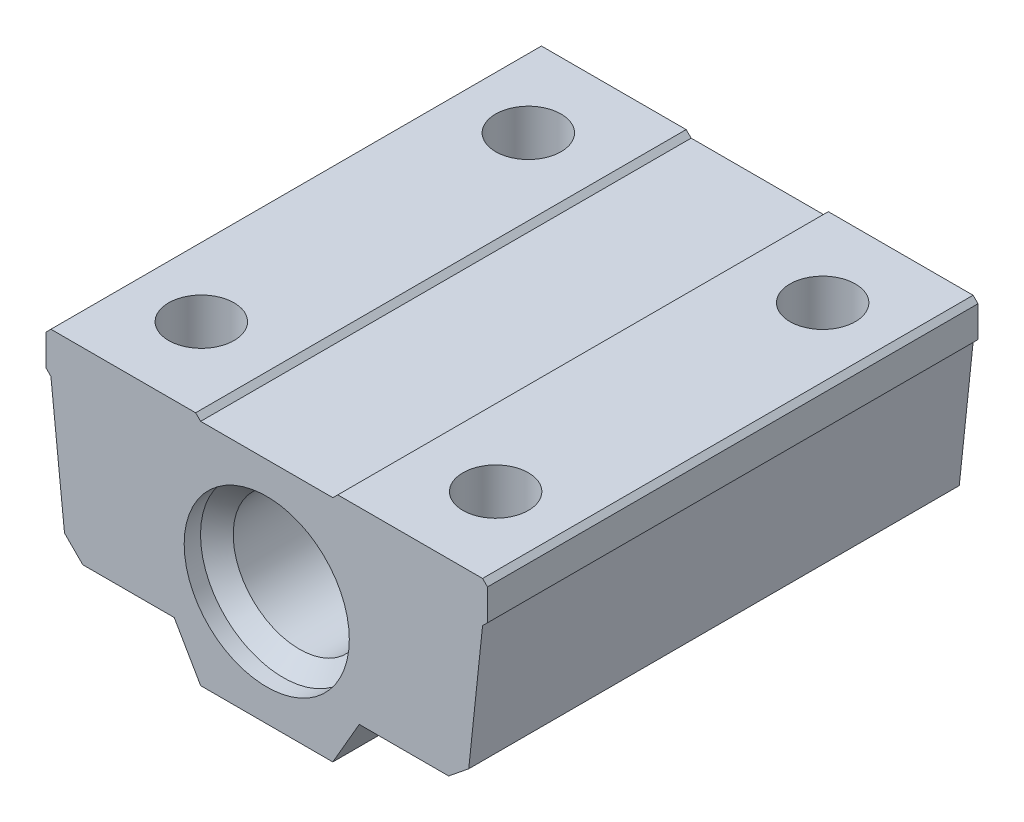
ISO-10303-21;
HEADER;
FILE_DESCRIPTION(('STEP AP214'),'2;1');
FILE_NAME('part.step','',(''),(''),'','','');
FILE_SCHEMA(('AUTOMOTIVE_DESIGN { 1 0 10303 214 1 1 1 1 }'));
ENDSEC;
DATA;
#1=APPLICATION_CONTEXT('core data for automotive mechanical design processes');
#2=APPLICATION_PROTOCOL_DEFINITION('international standard','automotive_design',2000,#1);
#3=PRODUCT_CONTEXT('',#1,'mechanical');
#4=PRODUCT('Part','Part','',(#3));
#5=PRODUCT_RELATED_PRODUCT_CATEGORY('part','',(#4));
#6=PRODUCT_DEFINITION_FORMATION('','',#4);
#7=PRODUCT_DEFINITION_CONTEXT('part definition',#1,'design');
#8=PRODUCT_DEFINITION('design','',#6,#7);
#9=PRODUCT_DEFINITION_SHAPE('','',#8);
#10=(LENGTH_UNIT() NAMED_UNIT(*) SI_UNIT(.MILLI.,.METRE.));
#11=(NAMED_UNIT(*) PLANE_ANGLE_UNIT() SI_UNIT($,.RADIAN.));
#12=(NAMED_UNIT(*) SI_UNIT($,.STERADIAN.) SOLID_ANGLE_UNIT());
#13=UNCERTAINTY_MEASURE_WITH_UNIT(LENGTH_MEASURE(1.E-05),#10,'distance_accuracy_value','');
#14=(GEOMETRIC_REPRESENTATION_CONTEXT(3) GLOBAL_UNCERTAINTY_ASSIGNED_CONTEXT((#13)) GLOBAL_UNIT_ASSIGNED_CONTEXT((#10,
#11,#12)) REPRESENTATION_CONTEXT('',''));
#15=CARTESIAN_POINT('',(0.,0.,0.));
#16=DIRECTION('',(0.,0.,1.));
#17=DIRECTION('',(1.,0.,0.));
#18=AXIS2_PLACEMENT_3D('',#15,#16,#17);
#19=CARTESIAN_POINT('',(0.,0.,14.));
#20=DIRECTION('',(0.,0.,-1.));
#21=DIRECTION('',(-1.,0.,0.));
#22=AXIS2_PLACEMENT_3D('',#19,#20,#21);
#23=CYLINDRICAL_SURFACE('',#22,5.05);
#24=CARTESIAN_POINT('',(0.,0.,14.));
#25=DIRECTION('',(0.,0.,1.));
#26=DIRECTION('',(1.,0.,0.));
#27=AXIS2_PLACEMENT_3D('',#24,#25,#26);
#28=CIRCLE('',#27,5.05);
#29=CARTESIAN_POINT('',(5.05,0.,14.));
#30=VERTEX_POINT('',#29);
#31=EDGE_CURVE('E60',#30,#30,#28,.T.);
#32=ORIENTED_EDGE('',*,*,#31,.F.);
#33=EDGE_LOOP('',(#32));
#34=FACE_BOUND('',#33,.T.);
#35=CARTESIAN_POINT('',(0.,0.,-14.));
#36=DIRECTION('',(0.,0.,1.));
#37=DIRECTION('',(1.,0.,0.));
#38=AXIS2_PLACEMENT_3D('',#35,#36,#37);
#39=CIRCLE('',#38,5.05);
#40=CARTESIAN_POINT('',(5.05,0.,-14.));
#41=VERTEX_POINT('',#40);
#42=EDGE_CURVE('E64',#41,#41,#39,.T.);
#43=ORIENTED_EDGE('',*,*,#42,.T.);
#44=EDGE_LOOP('',(#43));
#45=FACE_BOUND('',#44,.T.);
#46=ADVANCED_FACE('F49',(#34,#45),#23,.T.);
#47=CARTESIAN_POINT('',(0.,0.,-15.));
#48=DIRECTION('',(0.,0.,1.));
#49=DIRECTION('',(1.,0.,0.));
#50=AXIS2_PLACEMENT_3D('',#47,#48,#49);
#51=CYLINDRICAL_SURFACE('',#50,4.05);
#52=CARTESIAN_POINT('',(0.,0.,-13.));
#53=DIRECTION('',(0.,0.,1.));
#54=DIRECTION('',(1.,0.,0.));
#55=AXIS2_PLACEMENT_3D('',#52,#53,#54);
#56=CIRCLE('',#55,4.05);
#57=CARTESIAN_POINT('',(4.05,0.,-13.));
#58=VERTEX_POINT('',#57);
#59=EDGE_CURVE('E11',#58,#58,#56,.F.);
#60=ORIENTED_EDGE('',*,*,#59,.T.);
#61=EDGE_LOOP('',(#60));
#62=FACE_BOUND('',#61,.T.);
#63=CARTESIAN_POINT('',(0.,0.,13.));
#64=DIRECTION('',(0.,0.,1.));
#65=DIRECTION('',(1.,0.,0.));
#66=AXIS2_PLACEMENT_3D('',#63,#64,#65);
#67=CIRCLE('',#66,4.05);
#68=CARTESIAN_POINT('',(4.05,0.,13.));
#69=VERTEX_POINT('',#68);
#70=EDGE_CURVE('E56',#69,#69,#67,.T.);
#71=ORIENTED_EDGE('',*,*,#70,.T.);
#72=EDGE_LOOP('',(#71));
#73=FACE_BOUND('',#72,.T.);
#74=ADVANCED_FACE('F73',(#62,#73),#51,.F.);
#75=CARTESIAN_POINT('',(0.,0.,-14.));
#76=DIRECTION('',(0.,0.,-1.));
#77=DIRECTION('',(-1.,0.,0.));
#78=AXIS2_PLACEMENT_3D('',#75,#76,#77);
#79=CONICAL_SURFACE('',#78,5.05,0.785398163397447);
#80=ORIENTED_EDGE('',*,*,#59,.F.);
#81=EDGE_LOOP('',(#80));
#82=FACE_BOUND('',#81,.T.);
#83=ORIENTED_EDGE('',*,*,#42,.F.);
#84=EDGE_LOOP('',(#83));
#85=FACE_BOUND('',#84,.T.);
#86=ADVANCED_FACE('F71',(#82,#85),#79,.F.);
#87=CARTESIAN_POINT('',(0.,0.,13.));
#88=DIRECTION('',(0.,0.,1.));
#89=DIRECTION('',(1.,0.,0.));
#90=AXIS2_PLACEMENT_3D('',#87,#88,#89);
#91=CONICAL_SURFACE('',#90,4.05,0.785398163397448);
#92=ORIENTED_EDGE('',*,*,#31,.T.);
#93=EDGE_LOOP('',(#92));
#94=FACE_BOUND('',#93,.T.);
#95=ORIENTED_EDGE('',*,*,#70,.F.);
#96=EDGE_LOOP('',(#95));
#97=FACE_BOUND('',#96,.T.);
#98=ADVANCED_FACE('F51',(#94,#97),#91,.F.);
#99=CLOSED_SHELL('',(#46,#74,#86,#98));
#100=MANIFOLD_SOLID_BREP('B2',#99);
#101=CARTESIAN_POINT('',(4.04145188432738,-7.,15.));
#102=DIRECTION('',(-0.866025403784439,0.5,0.));
#103=DIRECTION('',(-0.5,-0.866025403784439,0.));
#104=AXIS2_PLACEMENT_3D('',#101,#102,#103);
#105=PLANE('',#104);
#106=DIRECTION('',(0.,0.,-1.));
#107=VECTOR('',#106,1.);
#108=CARTESIAN_POINT('',(5.65803263805833,-4.2,15.));
#109=LINE('',#108,#107);
#110=CARTESIAN_POINT('',(5.65803263805833,-4.2,15.));
#111=VERTEX_POINT('',#110);
#112=CARTESIAN_POINT('',(5.65803263805833,-4.2,-15.));
#113=VERTEX_POINT('',#112);
#114=EDGE_CURVE('E357',#111,#113,#109,.T.);
#115=ORIENTED_EDGE('',*,*,#114,.F.);
#116=DIRECTION('',(0.5,0.866025403784439,0.));
#117=VECTOR('',#116,1.);
#118=CARTESIAN_POINT('',(4.04145188432738,-7.,15.));
#119=LINE('',#118,#117);
#120=CARTESIAN_POINT('',(4.04145188432738,-7.,15.));
#121=VERTEX_POINT('',#120);
#122=EDGE_CURVE('E365',#121,#111,#119,.T.);
#123=ORIENTED_EDGE('',*,*,#122,.F.);
#124=DIRECTION('',(0.,0.,-1.));
#125=VECTOR('',#124,1.);
#126=CARTESIAN_POINT('',(4.04145188432738,-7.,15.));
#127=LINE('',#126,#125);
#128=CARTESIAN_POINT('',(4.04145188432738,-7.,-15.));
#129=VERTEX_POINT('',#128);
#130=EDGE_CURVE('E396',#121,#129,#127,.T.);
#131=ORIENTED_EDGE('',*,*,#130,.T.);
#132=DIRECTION('',(0.5,0.866025403784439,0.));
#133=VECTOR('',#132,1.);
#134=CARTESIAN_POINT('',(4.04145188432738,-7.,-15.));
#135=LINE('',#134,#133);
#136=EDGE_CURVE('E380',#129,#113,#135,.T.);
#137=ORIENTED_EDGE('',*,*,#136,.T.);
#138=EDGE_LOOP('',(#115,#123,#131,#137));
#139=FACE_BOUND('',#138,.T.);
#140=ADVANCED_FACE('F113',(#139),#105,.F.);
#141=CARTESIAN_POINT('',(-8.08290376865476,0.,15.));
#142=DIRECTION('',(0.866025403784438,0.5,0.));
#143=DIRECTION('',(-0.5,0.866025403784439,0.));
#144=AXIS2_PLACEMENT_3D('',#141,#142,#143);
#145=PLANE('',#144);
#146=DIRECTION('',(0.,0.,-1.));
#147=VECTOR('',#146,1.);
#148=CARTESIAN_POINT('',(-5.65803263805833,-4.2,15.));
#149=LINE('',#148,#147);
#150=CARTESIAN_POINT('',(-5.65803263805833,-4.2,15.));
#151=VERTEX_POINT('',#150);
#152=CARTESIAN_POINT('',(-5.65803263805833,-4.2,-15.));
#153=VERTEX_POINT('',#152);
#154=EDGE_CURVE('E329',#151,#153,#149,.T.);
#155=ORIENTED_EDGE('',*,*,#154,.T.);
#156=DIRECTION('',(0.5,-0.866025403784438,0.));
#157=VECTOR('',#156,1.);
#158=CARTESIAN_POINT('',(-8.08290376865476,0.,-15.));
#159=LINE('',#158,#157);
#160=CARTESIAN_POINT('',(-4.04145188432738,-7.,-15.));
#161=VERTEX_POINT('',#160);
#162=EDGE_CURVE('E366',#153,#161,#159,.T.);
#163=ORIENTED_EDGE('',*,*,#162,.T.);
#164=DIRECTION('',(0.,0.,-1.));
#165=VECTOR('',#164,1.);
#166=CARTESIAN_POINT('',(-4.04145188432738,-7.,15.));
#167=LINE('',#166,#165);
#168=CARTESIAN_POINT('',(-4.04145188432738,-7.,15.));
#169=VERTEX_POINT('',#168);
#170=EDGE_CURVE('E376',#169,#161,#167,.T.);
#171=ORIENTED_EDGE('',*,*,#170,.F.);
#172=DIRECTION('',(0.5,-0.866025403784438,0.));
#173=VECTOR('',#172,1.);
#174=CARTESIAN_POINT('',(-8.08290376865476,0.,15.));
#175=LINE('',#174,#173);
#176=EDGE_CURVE('E373',#151,#169,#175,.T.);
#177=ORIENTED_EDGE('',*,*,#176,.F.);
#178=EDGE_LOOP('',(#155,#163,#171,#177));
#179=FACE_BOUND('',#178,.T.);
#180=ADVANCED_FACE('F535',(#179),#145,.F.);
#181=CARTESIAN_POINT('',(-4.04145188432738,-7.,15.));
#182=DIRECTION('',(0.,1.,0.));
#183=DIRECTION('',(-1.,0.,0.));
#184=AXIS2_PLACEMENT_3D('',#181,#182,#183);
#185=PLANE('',#184);
#186=DIRECTION('',(1.,0.,0.));
#187=VECTOR('',#186,1.);
#188=CARTESIAN_POINT('',(-4.04145188432738,-7.,-15.));
#189=LINE('',#188,#187);
#190=EDGE_CURVE('E360',#161,#129,#189,.T.);
#191=ORIENTED_EDGE('',*,*,#190,.T.);
#192=ORIENTED_EDGE('',*,*,#130,.F.);
#193=DIRECTION('',(1.,0.,0.));
#194=VECTOR('',#193,1.);
#195=CARTESIAN_POINT('',(-4.04145188432738,-7.,15.));
#196=LINE('',#195,#194);
#197=EDGE_CURVE('E361',#169,#121,#196,.T.);
#198=ORIENTED_EDGE('',*,*,#197,.F.);
#199=ORIENTED_EDGE('',*,*,#170,.T.);
#200=EDGE_LOOP('',(#191,#192,#198,#199));
#201=FACE_BOUND('',#200,.T.);
#202=ADVANCED_FACE('F541',(#201),#185,.F.);
#203=CARTESIAN_POINT('',(4.04145188432738,7.,15.));
#204=DIRECTION('',(0.,-1.,0.));
#205=DIRECTION('',(0.,0.,-1.));
#206=AXIS2_PLACEMENT_3D('',#203,#204,#205);
#207=PLANE('',#206);
#208=DIRECTION('',(-1.,0.,0.));
#209=VECTOR('',#208,1.);
#210=CARTESIAN_POINT('',(4.04145188432738,7.,-15.));
#211=LINE('',#210,#209);
#212=CARTESIAN_POINT('',(4.04516962656286,7.,-15.));
#213=VERTEX_POINT('',#212);
#214=CARTESIAN_POINT('',(-4.04145188432738,7.,-15.));
#215=VERTEX_POINT('',#214);
#216=EDGE_CURVE('E384',#213,#215,#211,.T.);
#217=ORIENTED_EDGE('',*,*,#216,.T.);
#218=DIRECTION('',(0.,0.,-1.));
#219=VECTOR('',#218,1.);
#220=CARTESIAN_POINT('',(-4.04145188432738,7.,15.));
#221=LINE('',#220,#219);
#222=CARTESIAN_POINT('',(-4.04145188432738,7.,15.));
#223=VERTEX_POINT('',#222);
#224=EDGE_CURVE('E392',#223,#215,#221,.T.);
#225=ORIENTED_EDGE('',*,*,#224,.F.);
#226=DIRECTION('',(-1.,0.,0.));
#227=VECTOR('',#226,1.);
#228=CARTESIAN_POINT('',(4.04145188432738,7.,15.));
#229=LINE('',#228,#227);
#230=CARTESIAN_POINT('',(4.04516962656286,7.,15.));
#231=VERTEX_POINT('',#230);
#232=EDGE_CURVE('E370',#231,#223,#229,.T.);
#233=ORIENTED_EDGE('',*,*,#232,.F.);
#234=DIRECTION('',(0.,0.,1.));
#235=VECTOR('',#234,1.);
#236=CARTESIAN_POINT('',(4.04516962656286,7.,15.));
#237=LINE('',#236,#235);
#238=EDGE_CURVE('E452',#231,#213,#237,.F.);
#239=ORIENTED_EDGE('',*,*,#238,.T.);
#240=EDGE_LOOP('',(#217,#225,#233,#239));
#241=FACE_BOUND('',#240,.T.);
#242=ADVANCED_FACE('F547',(#241),#207,.F.);
#243=CARTESIAN_POINT('',(0.,0.,15.));
#244=DIRECTION('',(0.,0.,1.));
#245=DIRECTION('',(1.,0.,0.));
#246=AXIS2_PLACEMENT_3D('',#243,#244,#245);
#247=PLANE('',#246);
#248=CARTESIAN_POINT('',(0.,0.,15.));
#249=DIRECTION('',(0.,0.,1.));
#250=DIRECTION('',(1.,0.,0.));
#251=AXIS2_PLACEMENT_3D('',#248,#249,#250);
#252=CIRCLE('',#251,5.05);
#253=CARTESIAN_POINT('',(5.05,0.,15.));
#254=VERTEX_POINT('',#253);
#255=EDGE_CURVE('E498',#254,#254,#252,.T.);
#256=ORIENTED_EDGE('',*,*,#255,.F.);
#257=EDGE_LOOP('',(#256));
#258=FACE_BOUND('',#257,.T.);
#259=DIRECTION('',(1.,0.,0.));
#260=VECTOR('',#259,1.);
#261=CARTESIAN_POINT('',(5.65803263805833,-4.2,15.));
#262=LINE('',#261,#260);
#263=CARTESIAN_POINT('',(11.1257763975155,-4.2,15.));
#264=VERTEX_POINT('',#263);
#265=EDGE_CURVE('E303',#111,#264,#262,.T.);
#266=ORIENTED_EDGE('',*,*,#265,.T.);
#267=DIRECTION('',(-0.777426792575264,-0.628973435199086,0.));
#268=VECTOR('',#267,1.);
#269=CARTESIAN_POINT('',(6.45516086200057,-7.97873920210005,15.));
#270=LINE('',#269,#268);
#271=CARTESIAN_POINT('',(12.3549723756906,-3.20552486187844,15.));
#272=VERTEX_POINT('',#271);
#273=EDGE_CURVE('E284',#264,#272,#270,.F.);
#274=ORIENTED_EDGE('',*,*,#273,.T.);
#275=DIRECTION('',(-0.104972375690609,-0.994475138121547,0.));
#276=VECTOR('',#275,1.);
#277=CARTESIAN_POINT('',(13.2,4.8,15.));
#278=LINE('',#277,#276);
#279=CARTESIAN_POINT('',(13.2,4.8,15.));
#280=VERTEX_POINT('',#279);
#281=EDGE_CURVE('E275',#280,#272,#278,.T.);
#282=ORIENTED_EDGE('',*,*,#281,.F.);
#283=DIRECTION('',(-0.707106781186543,-0.707106781186552,0.));
#284=VECTOR('',#283,1.);
#285=CARTESIAN_POINT('',(4.20000000000008,-4.20000000000003,15.));
#286=LINE('',#285,#284);
#287=CARTESIAN_POINT('',(13.5,5.1,15.));
#288=VERTEX_POINT('',#287);
#289=EDGE_CURVE('E258',#280,#288,#286,.F.);
#290=ORIENTED_EDGE('',*,*,#289,.T.);
#291=DIRECTION('',(0.,1.,0.));
#292=VECTOR('',#291,1.);
#293=CARTESIAN_POINT('',(13.5,-4.2,15.));
#294=LINE('',#293,#292);
#295=CARTESIAN_POINT('',(13.5,7.00000000000001,15.));
#296=VERTEX_POINT('',#295);
#297=EDGE_CURVE('E306',#288,#296,#294,.T.);
#298=ORIENTED_EDGE('',*,*,#297,.T.);
#299=DIRECTION('',(0.707106781186544,-0.707106781186551,0.));
#300=VECTOR('',#299,1.);
#301=CARTESIAN_POINT('',(10.2500000000001,10.25,15.));
#302=LINE('',#301,#300);
#303=CARTESIAN_POINT('',(13.2,7.3,15.));
#304=VERTEX_POINT('',#303);
#305=EDGE_CURVE('E435',#296,#304,#302,.F.);
#306=ORIENTED_EDGE('',*,*,#305,.T.);
#307=DIRECTION('',(-1.,0.,0.));
#308=VECTOR('',#307,1.);
#309=CARTESIAN_POINT('',(13.5,7.3,15.));
#310=LINE('',#309,#308);
#311=CARTESIAN_POINT('',(4.34516962656286,7.3,15.));
#312=VERTEX_POINT('',#311);
#313=EDGE_CURVE('E310',#304,#312,#310,.T.);
#314=ORIENTED_EDGE('',*,*,#313,.T.);
#315=DIRECTION('',(0.707106781186545,0.707106781186551,0.));
#316=VECTOR('',#315,1.);
#317=CARTESIAN_POINT('',(-1.47741518671855,1.47741518671854,15.));
#318=LINE('',#317,#316);
#319=EDGE_CURVE('E428',#312,#231,#318,.F.);
#320=ORIENTED_EDGE('',*,*,#319,.T.);
#321=ORIENTED_EDGE('',*,*,#232,.T.);
#322=DIRECTION('',(-0.0123915226505512,0.99992322213578,0.));
#323=VECTOR('',#322,1.);
#324=CARTESIAN_POINT('',(-4.04516962656285,7.3,15.));
#325=LINE('',#324,#323);
#326=CARTESIAN_POINT('',(-4.04145216976769,7.00002303335925,15.));
#327=VERTEX_POINT('',#326);
#328=EDGE_CURVE('E314',#223,#327,#325,.T.);
#329=ORIENTED_EDGE('',*,*,#328,.T.);
#330=DIRECTION('',(0.715814620733543,-0.698290361342683,0.));
#331=VECTOR('',#330,1.);
#332=CARTESIAN_POINT('',(1.52828648051066,1.56664028029176,15.));
#333=LINE('',#332,#331);
#334=CARTESIAN_POINT('',(-4.34895734310541,7.3,15.));
#335=VERTEX_POINT('',#334);
#336=EDGE_CURVE('E425',#327,#335,#333,.F.);
#337=ORIENTED_EDGE('',*,*,#336,.T.);
#338=DIRECTION('',(-1.,0.,0.));
#339=VECTOR('',#338,1.);
#340=CARTESIAN_POINT('',(-13.5,7.3,15.));
#341=LINE('',#340,#339);
#342=CARTESIAN_POINT('',(-13.2,7.3,15.));
#343=VERTEX_POINT('',#342);
#344=EDGE_CURVE('E318',#335,#343,#341,.T.);
#345=ORIENTED_EDGE('',*,*,#344,.T.);
#346=DIRECTION('',(0.707106781186549,0.707106781186547,0.));
#347=VECTOR('',#346,1.);
#348=CARTESIAN_POINT('',(-10.25,10.25,15.));
#349=LINE('',#348,#347);
#350=CARTESIAN_POINT('',(-13.5,7.,15.));
#351=VERTEX_POINT('',#350);
#352=EDGE_CURVE('E432',#343,#351,#349,.F.);
#353=ORIENTED_EDGE('',*,*,#352,.T.);
#354=DIRECTION('',(0.,-1.,0.));
#355=VECTOR('',#354,1.);
#356=CARTESIAN_POINT('',(-13.5,-4.2,15.));
#357=LINE('',#356,#355);
#358=CARTESIAN_POINT('',(-13.5,5.1,15.));
#359=VERTEX_POINT('',#358);
#360=EDGE_CURVE('E322',#351,#359,#357,.T.);
#361=ORIENTED_EDGE('',*,*,#360,.T.);
#362=DIRECTION('',(-0.707106781186539,0.707106781186556,0.));
#363=VECTOR('',#362,1.);
#364=CARTESIAN_POINT('',(-4.20000000000016,-4.20000000000006,15.));
#365=LINE('',#364,#363);
#366=CARTESIAN_POINT('',(-13.2,4.8,15.));
#367=VERTEX_POINT('',#366);
#368=EDGE_CURVE('E268',#359,#367,#365,.F.);
#369=ORIENTED_EDGE('',*,*,#368,.T.);
#370=DIRECTION('',(-0.104972375690609,0.994475138121547,0.));
#371=VECTOR('',#370,1.);
#372=CARTESIAN_POINT('',(-13.2,4.8,15.));
#373=LINE('',#372,#371);
#374=CARTESIAN_POINT('',(-12.3680124223602,-3.08198757763976,15.));
#375=VERTEX_POINT('',#374);
#376=EDGE_CURVE('E298',#375,#367,#373,.T.);
#377=ORIENTED_EDGE('',*,*,#376,.F.);
#378=DIRECTION('',(-0.70710678118655,0.707106781186545,0.));
#379=VECTOR('',#378,1.);
#380=CARTESIAN_POINT('',(-7.72499999999995,-7.72500000000001,15.));
#381=LINE('',#380,#379);
#382=CARTESIAN_POINT('',(-11.25,-4.2,15.));
#383=VERTEX_POINT('',#382);
#384=EDGE_CURVE('E474',#375,#383,#381,.F.);
#385=ORIENTED_EDGE('',*,*,#384,.T.);
#386=DIRECTION('',(1.,0.,0.));
#387=VECTOR('',#386,1.);
#388=CARTESIAN_POINT('',(-5.65803263805833,-4.2,15.));
#389=LINE('',#388,#387);
#390=EDGE_CURVE('E326',#383,#151,#389,.T.);
#391=ORIENTED_EDGE('',*,*,#390,.T.);
#392=ORIENTED_EDGE('',*,*,#176,.T.);
#393=ORIENTED_EDGE('',*,*,#197,.T.);
#394=ORIENTED_EDGE('',*,*,#122,.T.);
#395=EDGE_LOOP('',(#266,#274,#282,#290,#298,#306,#314,#320,#321,#329,#337,#345,#353,#361,#369,
#377,#385,#391,#392,#393,#394));
#396=FACE_BOUND('',#395,.T.);
#397=ADVANCED_FACE('F283',(#258,#396),#247,.T.);
#398=CARTESIAN_POINT('',(0.,0.,-15.));
#399=DIRECTION('',(0.,0.,1.));
#400=DIRECTION('',(1.,0.,0.));
#401=AXIS2_PLACEMENT_3D('',#398,#399,#400);
#402=PLANE('',#401);
#403=CARTESIAN_POINT('',(0.,0.,-15.));
#404=DIRECTION('',(0.,0.,1.));
#405=DIRECTION('',(1.,0.,0.));
#406=AXIS2_PLACEMENT_3D('',#403,#404,#405);
#407=CIRCLE('',#406,5.05);
#408=CARTESIAN_POINT('',(5.05,0.,-15.));
#409=VERTEX_POINT('',#408);
#410=EDGE_CURVE('E295',#409,#409,#407,.T.);
#411=ORIENTED_EDGE('',*,*,#410,.T.);
#412=EDGE_LOOP('',(#411));
#413=FACE_BOUND('',#412,.T.);
#414=DIRECTION('',(-0.104972375690609,-0.994475138121547,0.));
#415=VECTOR('',#414,1.);
#416=CARTESIAN_POINT('',(13.2,4.8,-15.));
#417=LINE('',#416,#415);
#418=CARTESIAN_POINT('',(13.2,4.8,-15.));
#419=VERTEX_POINT('',#418);
#420=CARTESIAN_POINT('',(12.3549723756906,-3.20552486187844,-15.));
#421=VERTEX_POINT('',#420);
#422=EDGE_CURVE('E278',#419,#421,#417,.T.);
#423=ORIENTED_EDGE('',*,*,#422,.T.);
#424=DIRECTION('',(0.777426792575264,0.628973435199086,0.));
#425=VECTOR('',#424,1.);
#426=CARTESIAN_POINT('',(11.1257763975155,-4.2,-15.));
#427=LINE('',#426,#425);
#428=CARTESIAN_POINT('',(11.1257763975155,-4.2,-15.));
#429=VERTEX_POINT('',#428);
#430=EDGE_CURVE('E484',#421,#429,#427,.F.);
#431=ORIENTED_EDGE('',*,*,#430,.T.);
#432=DIRECTION('',(1.,0.,0.));
#433=VECTOR('',#432,1.);
#434=CARTESIAN_POINT('',(5.65803263805833,-4.2,-15.));
#435=LINE('',#434,#433);
#436=EDGE_CURVE('E280',#113,#429,#435,.T.);
#437=ORIENTED_EDGE('',*,*,#436,.F.);
#438=ORIENTED_EDGE('',*,*,#136,.F.);
#439=ORIENTED_EDGE('',*,*,#190,.F.);
#440=ORIENTED_EDGE('',*,*,#162,.F.);
#441=DIRECTION('',(1.,0.,0.));
#442=VECTOR('',#441,1.);
#443=CARTESIAN_POINT('',(-5.65803263805833,-4.2,-15.));
#444=LINE('',#443,#442);
#445=CARTESIAN_POINT('',(-11.25,-4.2,-15.));
#446=VERTEX_POINT('',#445);
#447=EDGE_CURVE('E307',#446,#153,#444,.T.);
#448=ORIENTED_EDGE('',*,*,#447,.F.);
#449=DIRECTION('',(0.70710678118655,-0.707106781186545,0.));
#450=VECTOR('',#449,1.);
#451=CARTESIAN_POINT('',(-12.3680124223602,-3.08198757763976,-15.));
#452=LINE('',#451,#450);
#453=CARTESIAN_POINT('',(-12.3680124223602,-3.08198757763976,-15.));
#454=VERTEX_POINT('',#453);
#455=EDGE_CURVE('E136',#446,#454,#452,.F.);
#456=ORIENTED_EDGE('',*,*,#455,.T.);
#457=DIRECTION('',(-0.104972375690609,0.994475138121547,0.));
#458=VECTOR('',#457,1.);
#459=CARTESIAN_POINT('',(-13.2,4.8,-15.));
#460=LINE('',#459,#458);
#461=CARTESIAN_POINT('',(-13.2,4.8,-15.));
#462=VERTEX_POINT('',#461);
#463=EDGE_CURVE('E292',#454,#462,#460,.T.);
#464=ORIENTED_EDGE('',*,*,#463,.T.);
#465=DIRECTION('',(0.707106781186539,-0.707106781186556,0.));
#466=VECTOR('',#465,1.);
#467=CARTESIAN_POINT('',(-13.5,5.1,-15.));
#468=LINE('',#467,#466);
#469=CARTESIAN_POINT('',(-13.5,5.1,-15.));
#470=VERTEX_POINT('',#469);
#471=EDGE_CURVE('E465',#462,#470,#468,.F.);
#472=ORIENTED_EDGE('',*,*,#471,.T.);
#473=DIRECTION('',(0.,-1.,0.));
#474=VECTOR('',#473,1.);
#475=CARTESIAN_POINT('',(-13.5,-4.2,-15.));
#476=LINE('',#475,#474);
#477=CARTESIAN_POINT('',(-13.5,7.,-15.));
#478=VERTEX_POINT('',#477);
#479=EDGE_CURVE('E348',#478,#470,#476,.T.);
#480=ORIENTED_EDGE('',*,*,#479,.F.);
#481=DIRECTION('',(-0.707106781186549,-0.707106781186547,0.));
#482=VECTOR('',#481,1.);
#483=CARTESIAN_POINT('',(-13.5,7.,-15.));
#484=LINE('',#483,#482);
#485=CARTESIAN_POINT('',(-13.2,7.3,-15.));
#486=VERTEX_POINT('',#485);
#487=EDGE_CURVE('E414',#478,#486,#484,.F.);
#488=ORIENTED_EDGE('',*,*,#487,.T.);
#489=DIRECTION('',(-1.,0.,0.));
#490=VECTOR('',#489,1.);
#491=CARTESIAN_POINT('',(-13.5,7.3,-15.));
#492=LINE('',#491,#490);
#493=CARTESIAN_POINT('',(-4.34895734310541,7.3,-15.));
#494=VERTEX_POINT('',#493);
#495=EDGE_CURVE('E344',#494,#486,#492,.T.);
#496=ORIENTED_EDGE('',*,*,#495,.F.);
#497=DIRECTION('',(-0.715814620733543,0.698290361342683,0.));
#498=VECTOR('',#497,1.);
#499=CARTESIAN_POINT('',(-4.34895734310541,7.3,-15.));
#500=LINE('',#499,#498);
#501=CARTESIAN_POINT('',(-4.04145216976769,7.00002303335925,-15.));
#502=VERTEX_POINT('',#501);
#503=EDGE_CURVE('E408',#494,#502,#500,.F.);
#504=ORIENTED_EDGE('',*,*,#503,.T.);
#505=DIRECTION('',(-0.0123915226505512,0.99992322213578,0.));
#506=VECTOR('',#505,1.);
#507=CARTESIAN_POINT('',(-4.04516962656285,7.3,-15.));
#508=LINE('',#507,#506);
#509=EDGE_CURVE('E340',#215,#502,#508,.T.);
#510=ORIENTED_EDGE('',*,*,#509,.F.);
#511=ORIENTED_EDGE('',*,*,#216,.F.);
#512=DIRECTION('',(-0.707106781186545,-0.707106781186551,0.));
#513=VECTOR('',#512,1.);
#514=CARTESIAN_POINT('',(4.04140523419236,6.9962356076295,-15.));
#515=LINE('',#514,#513);
#516=CARTESIAN_POINT('',(4.34516962656286,7.3,-15.));
#517=VERTEX_POINT('',#516);
#518=EDGE_CURVE('E411',#213,#517,#515,.F.);
#519=ORIENTED_EDGE('',*,*,#518,.T.);
#520=DIRECTION('',(-1.,0.,0.));
#521=VECTOR('',#520,1.);
#522=CARTESIAN_POINT('',(13.5,7.3,-15.));
#523=LINE('',#522,#521);
#524=CARTESIAN_POINT('',(13.2,7.3,-15.));
#525=VERTEX_POINT('',#524);
#526=EDGE_CURVE('E336',#525,#517,#523,.T.);
#527=ORIENTED_EDGE('',*,*,#526,.F.);
#528=DIRECTION('',(-0.707106781186544,0.707106781186551,0.));
#529=VECTOR('',#528,1.);
#530=CARTESIAN_POINT('',(13.2,7.3,-15.));
#531=LINE('',#530,#529);
#532=CARTESIAN_POINT('',(13.5,7.00000000000001,-15.));
#533=VERTEX_POINT('',#532);
#534=EDGE_CURVE('E417',#525,#533,#531,.F.);
#535=ORIENTED_EDGE('',*,*,#534,.T.);
#536=DIRECTION('',(0.,1.,0.));
#537=VECTOR('',#536,1.);
#538=CARTESIAN_POINT('',(13.5,-4.2,-15.));
#539=LINE('',#538,#537);
#540=CARTESIAN_POINT('',(13.5,5.1,-15.));
#541=VERTEX_POINT('',#540);
#542=EDGE_CURVE('E333',#541,#533,#539,.T.);
#543=ORIENTED_EDGE('',*,*,#542,.F.);
#544=DIRECTION('',(0.707106781186543,0.707106781186552,0.));
#545=VECTOR('',#544,1.);
#546=CARTESIAN_POINT('',(13.2,4.8,-15.));
#547=LINE('',#546,#545);
#548=EDGE_CURVE('E462',#541,#419,#547,.F.);
#549=ORIENTED_EDGE('',*,*,#548,.T.);
#550=EDGE_LOOP('',(#423,#431,#437,#438,#439,#440,#448,#456,#464,#472,#480,#488,#496,#504,#510,
#511,#519,#527,#535,#543,#549));
#551=FACE_BOUND('',#550,.T.);
#552=ADVANCED_FACE('F517',(#413,#551),#402,.F.);
#553=CARTESIAN_POINT('',(-13.5,7.3,15.));
#554=DIRECTION('',(0.,-1.,0.));
#555=DIRECTION('',(1.,0.,0.));
#556=AXIS2_PLACEMENT_3D('',#553,#554,#555);
#557=PLANE('',#556);
#558=CARTESIAN_POINT('',(-9.,7.3,10.));
#559=DIRECTION('',(0.,1.,0.));
#560=DIRECTION('',(-1.,0.,0.));
#561=AXIS2_PLACEMENT_3D('',#558,#559,#560);
#562=CIRCLE('',#561,2.);
#563=CARTESIAN_POINT('',(-11.,7.3,10.));
#564=VERTEX_POINT('',#563);
#565=EDGE_CURVE('E811',#564,#564,#562,.T.);
#566=ORIENTED_EDGE('',*,*,#565,.F.);
#567=EDGE_LOOP('',(#566));
#568=FACE_BOUND('',#567,.T.);
#569=CARTESIAN_POINT('',(-9.,7.3,-10.));
#570=DIRECTION('',(0.,1.,0.));
#571=DIRECTION('',(-1.,0.,0.));
#572=AXIS2_PLACEMENT_3D('',#569,#570,#571);
#573=CIRCLE('',#572,2.);
#574=CARTESIAN_POINT('',(-11.,7.3,-10.));
#575=VERTEX_POINT('',#574);
#576=EDGE_CURVE('E506',#575,#575,#573,.T.);
#577=ORIENTED_EDGE('',*,*,#576,.F.);
#578=EDGE_LOOP('',(#577));
#579=FACE_BOUND('',#578,.T.);
#580=ORIENTED_EDGE('',*,*,#495,.T.);
#581=DIRECTION('',(0.,0.,1.));
#582=VECTOR('',#581,1.);
#583=CARTESIAN_POINT('',(-13.2,7.3,15.));
#584=LINE('',#583,#582);
#585=EDGE_CURVE('E446',#486,#343,#584,.T.);
#586=ORIENTED_EDGE('',*,*,#585,.T.);
#587=ORIENTED_EDGE('',*,*,#344,.F.);
#588=DIRECTION('',(0.,0.,-1.));
#589=VECTOR('',#588,1.);
#590=CARTESIAN_POINT('',(-4.34895734310541,7.3,15.));
#591=LINE('',#590,#589);
#592=EDGE_CURVE('E442',#335,#494,#591,.T.);
#593=ORIENTED_EDGE('',*,*,#592,.T.);
#594=EDGE_LOOP('',(#580,#586,#587,#593));
#595=FACE_BOUND('',#594,.T.);
#596=ADVANCED_FACE('F606',(#568,#579,#595),#557,.F.);
#597=CARTESIAN_POINT('',(-13.5,-4.2,15.));
#598=DIRECTION('',(1.,0.,0.));
#599=DIRECTION('',(0.,0.,-1.));
#600=AXIS2_PLACEMENT_3D('',#597,#598,#599);
#601=PLANE('',#600);
#602=ORIENTED_EDGE('',*,*,#479,.T.);
#603=DIRECTION('',(0.,0.,1.));
#604=VECTOR('',#603,1.);
#605=CARTESIAN_POINT('',(-13.5,5.1,15.));
#606=LINE('',#605,#604);
#607=EDGE_CURVE('E269',#470,#359,#606,.T.);
#608=ORIENTED_EDGE('',*,*,#607,.T.);
#609=ORIENTED_EDGE('',*,*,#360,.F.);
#610=DIRECTION('',(0.,0.,-1.));
#611=VECTOR('',#610,1.);
#612=CARTESIAN_POINT('',(-13.5,7.,15.));
#613=LINE('',#612,#611);
#614=EDGE_CURVE('E438',#351,#478,#613,.T.);
#615=ORIENTED_EDGE('',*,*,#614,.T.);
#616=EDGE_LOOP('',(#602,#608,#609,#615));
#617=FACE_BOUND('',#616,.T.);
#618=ADVANCED_FACE('F600',(#617),#601,.F.);
#619=CARTESIAN_POINT('',(-5.65803263805833,-4.2,15.));
#620=DIRECTION('',(0.,1.,0.));
#621=DIRECTION('',(-1.,0.,0.));
#622=AXIS2_PLACEMENT_3D('',#619,#620,#621);
#623=PLANE('',#622);
#624=CARTESIAN_POINT('',(-9.,-4.2,10.));
#625=DIRECTION('',(0.,1.,0.));
#626=DIRECTION('',(-1.,0.,0.));
#627=AXIS2_PLACEMENT_3D('',#624,#625,#626);
#628=CIRCLE('',#627,2.);
#629=CARTESIAN_POINT('',(-11.,-4.2,10.));
#630=VERTEX_POINT('',#629);
#631=EDGE_CURVE('E117',#630,#630,#628,.T.);
#632=ORIENTED_EDGE('',*,*,#631,.T.);
#633=EDGE_LOOP('',(#632));
#634=FACE_BOUND('',#633,.T.);
#635=CARTESIAN_POINT('',(-9.,-4.2,-10.));
#636=DIRECTION('',(0.,1.,0.));
#637=DIRECTION('',(-1.,0.,0.));
#638=AXIS2_PLACEMENT_3D('',#635,#636,#637);
#639=CIRCLE('',#638,2.);
#640=CARTESIAN_POINT('',(-11.,-4.2,-10.));
#641=VERTEX_POINT('',#640);
#642=EDGE_CURVE('E489',#641,#641,#639,.T.);
#643=ORIENTED_EDGE('',*,*,#642,.T.);
#644=EDGE_LOOP('',(#643));
#645=FACE_BOUND('',#644,.T.);
#646=ORIENTED_EDGE('',*,*,#390,.F.);
#647=DIRECTION('',(0.,0.,-1.));
#648=VECTOR('',#647,1.);
#649=CARTESIAN_POINT('',(-11.25,-4.2,15.));
#650=LINE('',#649,#648);
#651=EDGE_CURVE('E47',#383,#446,#650,.T.);
#652=ORIENTED_EDGE('',*,*,#651,.T.);
#653=ORIENTED_EDGE('',*,*,#447,.T.);
#654=ORIENTED_EDGE('',*,*,#154,.F.);
#655=EDGE_LOOP('',(#646,#652,#653,#654));
#656=FACE_BOUND('',#655,.T.);
#657=ADVANCED_FACE('F590',(#634,#645,#656),#623,.F.);
#658=CARTESIAN_POINT('',(-4.04516962656285,7.3,15.));
#659=DIRECTION('',(-0.99992322213578,-0.0123915226505512,0.));
#660=DIRECTION('',(0.0123915226505512,-0.99992322213578,0.));
#661=AXIS2_PLACEMENT_3D('',#658,#659,#660);
#662=PLANE('',#661);
#663=ORIENTED_EDGE('',*,*,#509,.T.);
#664=DIRECTION('',(0.,0.,1.));
#665=VECTOR('',#664,1.);
#666=CARTESIAN_POINT('',(-4.04145216976769,7.00002303335925,15.));
#667=LINE('',#666,#665);
#668=EDGE_CURVE('E449',#502,#327,#667,.T.);
#669=ORIENTED_EDGE('',*,*,#668,.T.);
#670=ORIENTED_EDGE('',*,*,#328,.F.);
#671=ORIENTED_EDGE('',*,*,#224,.T.);
#672=EDGE_LOOP('',(#663,#669,#670,#671));
#673=FACE_BOUND('',#672,.T.);
#674=ADVANCED_FACE('F613',(#673),#662,.F.);
#675=CARTESIAN_POINT('',(5.65803263805833,-4.2,15.));
#676=DIRECTION('',(0.,1.,0.));
#677=DIRECTION('',(0.,0.,1.));
#678=AXIS2_PLACEMENT_3D('',#675,#676,#677);
#679=PLANE('',#678);
#680=CARTESIAN_POINT('',(9.,-4.2,10.));
#681=DIRECTION('',(0.,1.,0.));
#682=DIRECTION('',(0.,0.,1.));
#683=AXIS2_PLACEMENT_3D('',#680,#681,#682);
#684=CIRCLE('',#683,2.);
#685=CARTESIAN_POINT('',(9.,-4.2,12.));
#686=VERTEX_POINT('',#685);
#687=EDGE_CURVE('E492',#686,#686,#684,.T.);
#688=ORIENTED_EDGE('',*,*,#687,.T.);
#689=EDGE_LOOP('',(#688));
#690=FACE_BOUND('',#689,.T.);
#691=CARTESIAN_POINT('',(9.,-4.2,-10.));
#692=DIRECTION('',(0.,1.,0.));
#693=DIRECTION('',(0.,0.,1.));
#694=AXIS2_PLACEMENT_3D('',#691,#692,#693);
#695=CIRCLE('',#694,2.);
#696=CARTESIAN_POINT('',(9.,-4.2,-8.));
#697=VERTEX_POINT('',#696);
#698=EDGE_CURVE('E500',#697,#697,#695,.T.);
#699=ORIENTED_EDGE('',*,*,#698,.T.);
#700=EDGE_LOOP('',(#699));
#701=FACE_BOUND('',#700,.T.);
#702=ORIENTED_EDGE('',*,*,#436,.T.);
#703=DIRECTION('',(0.,0.,1.));
#704=VECTOR('',#703,1.);
#705=CARTESIAN_POINT('',(11.1257763975155,-4.2,15.));
#706=LINE('',#705,#704);
#707=EDGE_CURVE('E470',#429,#264,#706,.T.);
#708=ORIENTED_EDGE('',*,*,#707,.T.);
#709=ORIENTED_EDGE('',*,*,#265,.F.);
#710=ORIENTED_EDGE('',*,*,#114,.T.);
#711=EDGE_LOOP('',(#702,#708,#709,#710));
#712=FACE_BOUND('',#711,.T.);
#713=ADVANCED_FACE('F582',(#690,#701,#712),#679,.F.);
#714=CARTESIAN_POINT('',(13.5,-4.2,15.));
#715=DIRECTION('',(-1.,0.,0.));
#716=DIRECTION('',(0.,0.,1.));
#717=AXIS2_PLACEMENT_3D('',#714,#715,#716);
#718=PLANE('',#717);
#719=ORIENTED_EDGE('',*,*,#297,.F.);
#720=DIRECTION('',(0.,0.,-1.));
#721=VECTOR('',#720,1.);
#722=CARTESIAN_POINT('',(13.5,5.1,15.));
#723=LINE('',#722,#721);
#724=EDGE_CURVE('E263',#288,#541,#723,.T.);
#725=ORIENTED_EDGE('',*,*,#724,.T.);
#726=ORIENTED_EDGE('',*,*,#542,.T.);
#727=DIRECTION('',(0.,0.,1.));
#728=VECTOR('',#727,1.);
#729=CARTESIAN_POINT('',(13.5,7.00000000000001,15.));
#730=LINE('',#729,#728);
#731=EDGE_CURVE('E421',#533,#296,#730,.T.);
#732=ORIENTED_EDGE('',*,*,#731,.T.);
#733=EDGE_LOOP('',(#719,#725,#726,#732));
#734=FACE_BOUND('',#733,.T.);
#735=ADVANCED_FACE('F628',(#734),#718,.F.);
#736=CARTESIAN_POINT('',(13.5,7.3,15.));
#737=DIRECTION('',(0.,-1.,0.));
#738=DIRECTION('',(1.,0.,0.));
#739=AXIS2_PLACEMENT_3D('',#736,#737,#738);
#740=PLANE('',#739);
#741=CARTESIAN_POINT('',(9.,7.3,10.));
#742=DIRECTION('',(0.,1.,0.));
#743=DIRECTION('',(-1.,0.,0.));
#744=AXIS2_PLACEMENT_3D('',#741,#742,#743);
#745=CIRCLE('',#744,2.);
#746=CARTESIAN_POINT('',(7.,7.3,10.));
#747=VERTEX_POINT('',#746);
#748=EDGE_CURVE('E814',#747,#747,#745,.T.);
#749=ORIENTED_EDGE('',*,*,#748,.F.);
#750=EDGE_LOOP('',(#749));
#751=FACE_BOUND('',#750,.T.);
#752=CARTESIAN_POINT('',(9.,7.3,-10.));
#753=DIRECTION('',(0.,1.,0.));
#754=DIRECTION('',(-1.,0.,0.));
#755=AXIS2_PLACEMENT_3D('',#752,#753,#754);
#756=CIRCLE('',#755,2.);
#757=CARTESIAN_POINT('',(7.,7.3,-10.));
#758=VERTEX_POINT('',#757);
#759=EDGE_CURVE('E818',#758,#758,#756,.T.);
#760=ORIENTED_EDGE('',*,*,#759,.F.);
#761=EDGE_LOOP('',(#760));
#762=FACE_BOUND('',#761,.T.);
#763=ORIENTED_EDGE('',*,*,#313,.F.);
#764=DIRECTION('',(0.,0.,-1.));
#765=VECTOR('',#764,1.);
#766=CARTESIAN_POINT('',(13.2,7.3,15.));
#767=LINE('',#766,#765);
#768=EDGE_CURVE('E404',#304,#525,#767,.T.);
#769=ORIENTED_EDGE('',*,*,#768,.T.);
#770=ORIENTED_EDGE('',*,*,#526,.T.);
#771=DIRECTION('',(0.,0.,1.));
#772=VECTOR('',#771,1.);
#773=CARTESIAN_POINT('',(4.34516962656286,7.3,15.));
#774=LINE('',#773,#772);
#775=EDGE_CURVE('E400',#517,#312,#774,.T.);
#776=ORIENTED_EDGE('',*,*,#775,.T.);
#777=EDGE_LOOP('',(#763,#769,#770,#776));
#778=FACE_BOUND('',#777,.T.);
#779=ADVANCED_FACE('F555',(#751,#762,#778),#740,.F.);
#780=CARTESIAN_POINT('',(13.2,7.3,15.));
#781=DIRECTION('',(-0.707106781186551,-0.707106781186544,0.));
#782=DIRECTION('',(0.,0.,-1.));
#783=AXIS2_PLACEMENT_3D('',#780,#781,#782);
#784=PLANE('',#783);
#785=ORIENTED_EDGE('',*,*,#305,.F.);
#786=ORIENTED_EDGE('',*,*,#731,.F.);
#787=ORIENTED_EDGE('',*,*,#534,.F.);
#788=ORIENTED_EDGE('',*,*,#768,.F.);
#789=EDGE_LOOP('',(#785,#786,#787,#788));
#790=FACE_BOUND('',#789,.T.);
#791=ADVANCED_FACE('F551',(#790),#784,.F.);
#792=CARTESIAN_POINT('',(-13.5,7.,15.));
#793=DIRECTION('',(0.707106781186546,-0.707106781186548,0.));
#794=DIRECTION('',(0.,0.,-1.));
#795=AXIS2_PLACEMENT_3D('',#792,#793,#794);
#796=PLANE('',#795);
#797=ORIENTED_EDGE('',*,*,#352,.F.);
#798=ORIENTED_EDGE('',*,*,#585,.F.);
#799=ORIENTED_EDGE('',*,*,#487,.F.);
#800=ORIENTED_EDGE('',*,*,#614,.F.);
#801=EDGE_LOOP('',(#797,#798,#799,#800));
#802=FACE_BOUND('',#801,.T.);
#803=ADVANCED_FACE('F554',(#802),#796,.F.);
#804=CARTESIAN_POINT('',(4.04140523419236,6.9962356076295,15.));
#805=DIRECTION('',(0.707106781186551,-0.707106781186545,0.));
#806=DIRECTION('',(0.,0.,-1.));
#807=AXIS2_PLACEMENT_3D('',#804,#805,#806);
#808=PLANE('',#807);
#809=ORIENTED_EDGE('',*,*,#319,.F.);
#810=ORIENTED_EDGE('',*,*,#775,.F.);
#811=ORIENTED_EDGE('',*,*,#518,.F.);
#812=ORIENTED_EDGE('',*,*,#238,.F.);
#813=EDGE_LOOP('',(#809,#810,#811,#812));
#814=FACE_BOUND('',#813,.T.);
#815=ADVANCED_FACE('F559',(#814),#808,.F.);
#816=CARTESIAN_POINT('',(-4.34895734310541,7.3,15.));
#817=DIRECTION('',(-0.698290361342683,-0.715814620733542,0.));
#818=DIRECTION('',(0.,0.,-1.));
#819=AXIS2_PLACEMENT_3D('',#816,#817,#818);
#820=PLANE('',#819);
#821=ORIENTED_EDGE('',*,*,#336,.F.);
#822=ORIENTED_EDGE('',*,*,#668,.F.);
#823=ORIENTED_EDGE('',*,*,#503,.F.);
#824=ORIENTED_EDGE('',*,*,#592,.F.);
#825=EDGE_LOOP('',(#821,#822,#823,#824));
#826=FACE_BOUND('',#825,.T.);
#827=ADVANCED_FACE('F563',(#826),#820,.F.);
#828=CARTESIAN_POINT('',(13.2,4.8,-15.));
#829=DIRECTION('',(-0.994475138121547,0.104972375690609,0.));
#830=DIRECTION('',(-0.104972375690609,-0.994475138121547,0.));
#831=AXIS2_PLACEMENT_3D('',#828,#829,#830);
#832=PLANE('',#831);
#833=ORIENTED_EDGE('',*,*,#281,.T.);
#834=DIRECTION('',(0.,0.,-1.));
#835=VECTOR('',#834,1.);
#836=CARTESIAN_POINT('',(12.3549723756906,-3.20552486187844,-15.));
#837=LINE('',#836,#835);
#838=EDGE_CURVE('E479',#272,#421,#837,.T.);
#839=ORIENTED_EDGE('',*,*,#838,.T.);
#840=ORIENTED_EDGE('',*,*,#422,.F.);
#841=DIRECTION('',(0.,0.,1.));
#842=VECTOR('',#841,1.);
#843=CARTESIAN_POINT('',(13.2,4.8,-15.));
#844=LINE('',#843,#842);
#845=EDGE_CURVE('E262',#419,#280,#844,.T.);
#846=ORIENTED_EDGE('',*,*,#845,.T.);
#847=EDGE_LOOP('',(#833,#839,#840,#846));
#848=FACE_BOUND('',#847,.T.);
#849=ADVANCED_FACE('F274',(#848),#832,.F.);
#850=CARTESIAN_POINT('',(-13.2,4.8,-15.));
#851=DIRECTION('',(0.994475138121547,0.104972375690609,0.));
#852=DIRECTION('',(-0.104972375690609,0.994475138121547,0.));
#853=AXIS2_PLACEMENT_3D('',#850,#851,#852);
#854=PLANE('',#853);
#855=ORIENTED_EDGE('',*,*,#463,.F.);
#856=DIRECTION('',(0.,0.,1.));
#857=VECTOR('',#856,1.);
#858=CARTESIAN_POINT('',(-12.3680124223602,-3.08198757763976,-15.));
#859=LINE('',#858,#857);
#860=EDGE_CURVE('E123',#454,#375,#859,.T.);
#861=ORIENTED_EDGE('',*,*,#860,.T.);
#862=ORIENTED_EDGE('',*,*,#376,.T.);
#863=DIRECTION('',(0.,0.,1.));
#864=VECTOR('',#863,1.);
#865=CARTESIAN_POINT('',(-13.2,4.8,-15.));
#866=LINE('',#865,#864);
#867=EDGE_CURVE('E286',#462,#367,#866,.T.);
#868=ORIENTED_EDGE('',*,*,#867,.F.);
#869=EDGE_LOOP('',(#855,#861,#862,#868));
#870=FACE_BOUND('',#869,.T.);
#871=ADVANCED_FACE('F571',(#870),#854,.F.);
#872=CARTESIAN_POINT('',(-13.5,5.1,15.));
#873=DIRECTION('',(0.707106781186556,0.707106781186539,0.));
#874=DIRECTION('',(0.,0.,1.));
#875=AXIS2_PLACEMENT_3D('',#872,#873,#874);
#876=PLANE('',#875);
#877=ORIENTED_EDGE('',*,*,#471,.F.);
#878=ORIENTED_EDGE('',*,*,#867,.T.);
#879=ORIENTED_EDGE('',*,*,#368,.F.);
#880=ORIENTED_EDGE('',*,*,#607,.F.);
#881=EDGE_LOOP('',(#877,#878,#879,#880));
#882=FACE_BOUND('',#881,.T.);
#883=ADVANCED_FACE('F568',(#882),#876,.F.);
#884=CARTESIAN_POINT('',(13.2,4.8,-15.));
#885=DIRECTION('',(-0.707106781186552,0.707106781186543,0.));
#886=DIRECTION('',(0.,0.,1.));
#887=AXIS2_PLACEMENT_3D('',#884,#885,#886);
#888=PLANE('',#887);
#889=ORIENTED_EDGE('',*,*,#548,.F.);
#890=ORIENTED_EDGE('',*,*,#724,.F.);
#891=ORIENTED_EDGE('',*,*,#289,.F.);
#892=ORIENTED_EDGE('',*,*,#845,.F.);
#893=EDGE_LOOP('',(#889,#890,#891,#892));
#894=FACE_BOUND('',#893,.T.);
#895=ADVANCED_FACE('F261',(#894),#888,.F.);
#896=CARTESIAN_POINT('',(11.1257763975155,-4.2,15.));
#897=DIRECTION('',(-0.628973435199086,0.777426792575263,0.));
#898=DIRECTION('',(0.,0.,1.));
#899=AXIS2_PLACEMENT_3D('',#896,#897,#898);
#900=PLANE('',#899);
#901=ORIENTED_EDGE('',*,*,#430,.F.);
#902=ORIENTED_EDGE('',*,*,#838,.F.);
#903=ORIENTED_EDGE('',*,*,#273,.F.);
#904=ORIENTED_EDGE('',*,*,#707,.F.);
#905=EDGE_LOOP('',(#901,#902,#903,#904));
#906=FACE_BOUND('',#905,.T.);
#907=ADVANCED_FACE('F530',(#906),#900,.F.);
#908=CARTESIAN_POINT('',(-12.3680124223602,-3.08198757763976,-15.));
#909=DIRECTION('',(0.707106781186545,0.70710678118655,0.));
#910=DIRECTION('',(0.,0.,1.));
#911=AXIS2_PLACEMENT_3D('',#908,#909,#910);
#912=PLANE('',#911);
#913=ORIENTED_EDGE('',*,*,#455,.F.);
#914=ORIENTED_EDGE('',*,*,#651,.F.);
#915=ORIENTED_EDGE('',*,*,#384,.F.);
#916=ORIENTED_EDGE('',*,*,#860,.F.);
#917=EDGE_LOOP('',(#913,#914,#915,#916));
#918=FACE_BOUND('',#917,.T.);
#919=ADVANCED_FACE('F115',(#918),#912,.F.);
#920=CARTESIAN_POINT('',(0.,0.,-15.));
#921=DIRECTION('',(0.,0.,1.));
#922=DIRECTION('',(1.,0.,0.));
#923=AXIS2_PLACEMENT_3D('',#920,#921,#922);
#924=CYLINDRICAL_SURFACE('',#923,5.05);
#925=ORIENTED_EDGE('',*,*,#410,.F.);
#926=EDGE_LOOP('',(#925));
#927=FACE_BOUND('',#926,.T.);
#928=ORIENTED_EDGE('',*,*,#255,.T.);
#929=EDGE_LOOP('',(#928));
#930=FACE_BOUND('',#929,.T.);
#931=ADVANCED_FACE('F519',(#927,#930),#924,.F.);
#932=CARTESIAN_POINT('',(9.,-7.,-10.));
#933=DIRECTION('',(0.,1.,0.));
#934=DIRECTION('',(-1.,0.,0.));
#935=AXIS2_PLACEMENT_3D('',#932,#933,#934);
#936=CYLINDRICAL_SURFACE('',#935,2.);
#937=ORIENTED_EDGE('',*,*,#759,.T.);
#938=EDGE_LOOP('',(#937));
#939=FACE_BOUND('',#938,.T.);
#940=ORIENTED_EDGE('',*,*,#698,.F.);
#941=EDGE_LOOP('',(#940));
#942=FACE_BOUND('',#941,.T.);
#943=ADVANCED_FACE('F521',(#939,#942),#936,.F.);
#944=CARTESIAN_POINT('',(9.,-7.,10.));
#945=DIRECTION('',(0.,1.,0.));
#946=DIRECTION('',(-1.,0.,0.));
#947=AXIS2_PLACEMENT_3D('',#944,#945,#946);
#948=CYLINDRICAL_SURFACE('',#947,2.);
#949=ORIENTED_EDGE('',*,*,#748,.T.);
#950=EDGE_LOOP('',(#949));
#951=FACE_BOUND('',#950,.T.);
#952=ORIENTED_EDGE('',*,*,#687,.F.);
#953=EDGE_LOOP('',(#952));
#954=FACE_BOUND('',#953,.T.);
#955=ADVANCED_FACE('F527',(#951,#954),#948,.F.);
#956=CARTESIAN_POINT('',(-9.,-7.,-10.));
#957=DIRECTION('',(0.,1.,0.));
#958=DIRECTION('',(-1.,0.,0.));
#959=AXIS2_PLACEMENT_3D('',#956,#957,#958);
#960=CYLINDRICAL_SURFACE('',#959,2.);
#961=ORIENTED_EDGE('',*,*,#576,.T.);
#962=EDGE_LOOP('',(#961));
#963=FACE_BOUND('',#962,.T.);
#964=ORIENTED_EDGE('',*,*,#642,.F.);
#965=EDGE_LOOP('',(#964));
#966=FACE_BOUND('',#965,.T.);
#967=ADVANCED_FACE('F786',(#963,#966),#960,.F.);
#968=CARTESIAN_POINT('',(-9.,-7.,10.));
#969=DIRECTION('',(0.,1.,0.));
#970=DIRECTION('',(-1.,0.,0.));
#971=AXIS2_PLACEMENT_3D('',#968,#969,#970);
#972=CYLINDRICAL_SURFACE('',#971,2.);
#973=ORIENTED_EDGE('',*,*,#565,.T.);
#974=EDGE_LOOP('',(#973));
#975=FACE_BOUND('',#974,.T.);
#976=ORIENTED_EDGE('',*,*,#631,.F.);
#977=EDGE_LOOP('',(#976));
#978=FACE_BOUND('',#977,.T.);
#979=ADVANCED_FACE('F796',(#975,#978),#972,.F.);
#980=CLOSED_SHELL('',(#140,#180,#202,#242,#397,#552,#596,#618,#657,#674,#713,#735,#779,#791,
#803,#815,#827,#849,#871,#883,#895,#907,#919,#931,#943,#955,#967,#979));
#981=MANIFOLD_SOLID_BREP('B6',#980);
#982=ADVANCED_BREP_SHAPE_REPRESENTATION('',(#18,#100,#981),#14);
#983=SHAPE_DEFINITION_REPRESENTATION(#9,#982);
ENDSEC;
END-ISO-10303-21;
